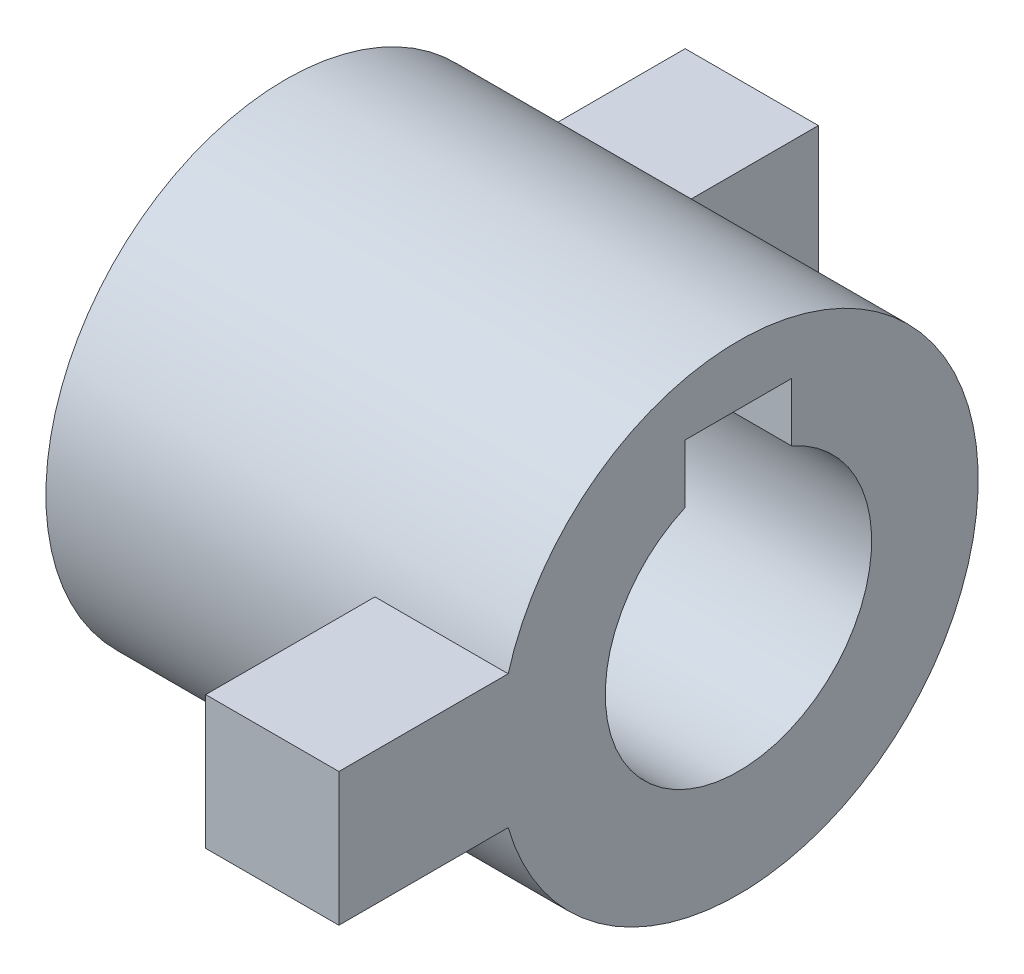
ISO-10303-21;
HEADER;
FILE_DESCRIPTION(('STEP AP214'),'2;1');
FILE_NAME('part.step','',(''),(''),'','','');
FILE_SCHEMA(('AUTOMOTIVE_DESIGN { 1 0 10303 214 1 1 1 1 }'));
ENDSEC;
DATA;
#1=APPLICATION_CONTEXT('core data for automotive mechanical design processes');
#2=APPLICATION_PROTOCOL_DEFINITION('international standard','automotive_design',2000,#1);
#3=PRODUCT_CONTEXT('',#1,'mechanical');
#4=PRODUCT('Part','Part','',(#3));
#5=PRODUCT_RELATED_PRODUCT_CATEGORY('part','',(#4));
#6=PRODUCT_DEFINITION_FORMATION('','',#4);
#7=PRODUCT_DEFINITION_CONTEXT('part definition',#1,'design');
#8=PRODUCT_DEFINITION('design','',#6,#7);
#9=PRODUCT_DEFINITION_SHAPE('','',#8);
#10=(LENGTH_UNIT() NAMED_UNIT(*) SI_UNIT(.MILLI.,.METRE.));
#11=(NAMED_UNIT(*) PLANE_ANGLE_UNIT() SI_UNIT($,.RADIAN.));
#12=(NAMED_UNIT(*) SI_UNIT($,.STERADIAN.) SOLID_ANGLE_UNIT());
#13=UNCERTAINTY_MEASURE_WITH_UNIT(LENGTH_MEASURE(1.E-05),#10,'distance_accuracy_value','');
#14=(GEOMETRIC_REPRESENTATION_CONTEXT(3) GLOBAL_UNCERTAINTY_ASSIGNED_CONTEXT((#13)) GLOBAL_UNIT_ASSIGNED_CONTEXT((#10,
#11,#12)) REPRESENTATION_CONTEXT('',''));
#15=CARTESIAN_POINT('',(0.,0.,0.));
#16=DIRECTION('',(0.,0.,1.));
#17=DIRECTION('',(1.,0.,0.));
#18=AXIS2_PLACEMENT_3D('',#15,#16,#17);
#19=CARTESIAN_POINT('',(17.,0.,0.));
#20=DIRECTION('',(-1.,0.,0.));
#21=DIRECTION('',(0.,0.,1.));
#22=AXIS2_PLACEMENT_3D('',#19,#20,#21);
#23=CYLINDRICAL_SURFACE('',#22,5.);
#24=CARTESIAN_POINT('',(17.,0.,0.));
#25=DIRECTION('',(1.,0.,0.));
#26=DIRECTION('',(0.,0.,-1.));
#27=AXIS2_PLACEMENT_3D('',#24,#25,#26);
#28=CIRCLE('',#27,5.);
#29=CARTESIAN_POINT('',(17.,4.58257569495584,2.));
#30=VERTEX_POINT('',#29);
#31=CARTESIAN_POINT('',(17.,4.58257569495584,-2.));
#32=VERTEX_POINT('',#31);
#33=EDGE_CURVE('E179',#30,#32,#28,.T.);
#34=ORIENTED_EDGE('',*,*,#33,.T.);
#35=DIRECTION('',(-1.,0.,0.));
#36=VECTOR('',#35,1.);
#37=CARTESIAN_POINT('',(17.,4.58257569495584,-2.));
#38=LINE('',#37,#36);
#39=CARTESIAN_POINT('',(0.,4.58257569495584,-2.));
#40=VERTEX_POINT('',#39);
#41=EDGE_CURVE('E190',#32,#40,#38,.T.);
#42=ORIENTED_EDGE('',*,*,#41,.T.);
#43=CARTESIAN_POINT('',(0.,0.,0.));
#44=DIRECTION('',(1.,0.,0.));
#45=DIRECTION('',(0.,0.,-1.));
#46=AXIS2_PLACEMENT_3D('',#43,#44,#45);
#47=CIRCLE('',#46,5.);
#48=CARTESIAN_POINT('',(0.,4.58257569495584,2.));
#49=VERTEX_POINT('',#48);
#50=EDGE_CURVE('E178',#49,#40,#47,.T.);
#51=ORIENTED_EDGE('',*,*,#50,.F.);
#52=DIRECTION('',(-1.,0.,0.));
#53=VECTOR('',#52,1.);
#54=CARTESIAN_POINT('',(17.,4.58257569495584,2.));
#55=LINE('',#54,#53);
#56=EDGE_CURVE('E209',#30,#49,#55,.T.);
#57=ORIENTED_EDGE('',*,*,#56,.F.);
#58=EDGE_LOOP('',(#34,#42,#51,#57));
#59=FACE_BOUND('',#58,.T.);
#60=ADVANCED_FACE('F35',(#59),#23,.F.);
#61=CARTESIAN_POINT('',(17.,0.,0.));
#62=DIRECTION('',(-1.,0.,0.));
#63=DIRECTION('',(0.,0.,1.));
#64=AXIS2_PLACEMENT_3D('',#61,#62,#63);
#65=CYLINDRICAL_SURFACE('',#64,9.);
#66=DIRECTION('',(-1.,0.,0.));
#67=VECTOR('',#66,1.);
#68=CARTESIAN_POINT('',(17.,-2.5,8.64580823289529));
#69=LINE('',#68,#67);
#70=CARTESIAN_POINT('',(17.,-2.5,8.64580823289529));
#71=VERTEX_POINT('',#70);
#72=CARTESIAN_POINT('',(12.,-2.5,8.64580823289529));
#73=VERTEX_POINT('',#72);
#74=EDGE_CURVE('E137',#71,#73,#69,.T.);
#75=ORIENTED_EDGE('',*,*,#74,.T.);
#76=CARTESIAN_POINT('',(12.,0.,0.));
#77=DIRECTION('',(1.,0.,0.));
#78=DIRECTION('',(0.,0.,-1.));
#79=AXIS2_PLACEMENT_3D('',#76,#77,#78);
#80=CIRCLE('',#79,9.);
#81=CARTESIAN_POINT('',(12.,2.5,8.64580823289529));
#82=VERTEX_POINT('',#81);
#83=EDGE_CURVE('E11',#82,#73,#80,.T.);
#84=ORIENTED_EDGE('',*,*,#83,.F.);
#85=DIRECTION('',(-1.,0.,0.));
#86=VECTOR('',#85,1.);
#87=CARTESIAN_POINT('',(17.,2.5,8.64580823289529));
#88=LINE('',#87,#86);
#89=CARTESIAN_POINT('',(17.,2.5,8.64580823289529));
#90=VERTEX_POINT('',#89);
#91=EDGE_CURVE('E164',#82,#90,#88,.F.);
#92=ORIENTED_EDGE('',*,*,#91,.T.);
#93=CARTESIAN_POINT('',(17.,0.,0.));
#94=DIRECTION('',(1.,0.,0.));
#95=DIRECTION('',(0.,0.,-1.));
#96=AXIS2_PLACEMENT_3D('',#93,#94,#95);
#97=CIRCLE('',#96,9.);
#98=EDGE_CURVE('E55',#71,#90,#97,.T.);
#99=ORIENTED_EDGE('',*,*,#98,.F.);
#100=EDGE_LOOP('',(#75,#84,#92,#99));
#101=FACE_BOUND('',#100,.T.);
#102=DIRECTION('',(-1.,0.,0.));
#103=VECTOR('',#102,1.);
#104=CARTESIAN_POINT('',(17.,-2.5,-8.64580823289529));
#105=LINE('',#104,#103);
#106=CARTESIAN_POINT('',(5.,-2.5,-8.64580823289529));
#107=VERTEX_POINT('',#106);
#108=CARTESIAN_POINT('',(0.,-2.5,-8.64580823289529));
#109=VERTEX_POINT('',#108);
#110=EDGE_CURVE('E156',#107,#109,#105,.T.);
#111=ORIENTED_EDGE('',*,*,#110,.F.);
#112=CARTESIAN_POINT('',(5.,0.,0.));
#113=DIRECTION('',(-1.,0.,0.));
#114=DIRECTION('',(0.,0.,1.));
#115=AXIS2_PLACEMENT_3D('',#112,#113,#114);
#116=CIRCLE('',#115,9.);
#117=CARTESIAN_POINT('',(5.,2.5,-8.64580823289529));
#118=VERTEX_POINT('',#117);
#119=EDGE_CURVE('E42',#118,#107,#116,.T.);
#120=ORIENTED_EDGE('',*,*,#119,.F.);
#121=DIRECTION('',(-1.,0.,0.));
#122=VECTOR('',#121,1.);
#123=CARTESIAN_POINT('',(17.,2.5,-8.64580823289529));
#124=LINE('',#123,#122);
#125=CARTESIAN_POINT('',(0.,2.5,-8.64580823289529));
#126=VERTEX_POINT('',#125);
#127=EDGE_CURVE('E176',#126,#118,#124,.F.);
#128=ORIENTED_EDGE('',*,*,#127,.F.);
#129=CARTESIAN_POINT('',(0.,0.,0.));
#130=DIRECTION('',(1.,0.,0.));
#131=DIRECTION('',(0.,0.,-1.));
#132=AXIS2_PLACEMENT_3D('',#129,#130,#131);
#133=CIRCLE('',#132,9.);
#134=EDGE_CURVE('E182',#126,#109,#133,.T.);
#135=ORIENTED_EDGE('',*,*,#134,.T.);
#136=EDGE_LOOP('',(#111,#120,#128,#135));
#137=FACE_BOUND('',#136,.T.);
#138=ADVANCED_FACE('F223',(#101,#137),#65,.T.);
#139=CARTESIAN_POINT('',(17.,0.,2.));
#140=DIRECTION('',(0.,0.,1.));
#141=DIRECTION('',(1.,0.,0.));
#142=AXIS2_PLACEMENT_3D('',#139,#140,#141);
#143=PLANE('',#142);
#144=DIRECTION('',(0.,1.,0.));
#145=VECTOR('',#144,1.);
#146=CARTESIAN_POINT('',(0.,0.,2.));
#147=LINE('',#146,#145);
#148=CARTESIAN_POINT('',(0.,6.78,2.));
#149=VERTEX_POINT('',#148);
#150=EDGE_CURVE('E192',#49,#149,#147,.T.);
#151=ORIENTED_EDGE('',*,*,#150,.T.);
#152=DIRECTION('',(-1.,0.,0.));
#153=VECTOR('',#152,1.);
#154=CARTESIAN_POINT('',(17.,6.78,2.));
#155=LINE('',#154,#153);
#156=CARTESIAN_POINT('',(17.,6.78,2.));
#157=VERTEX_POINT('',#156);
#158=EDGE_CURVE('E206',#157,#149,#155,.T.);
#159=ORIENTED_EDGE('',*,*,#158,.F.);
#160=DIRECTION('',(0.,1.,0.));
#161=VECTOR('',#160,1.);
#162=CARTESIAN_POINT('',(17.,0.,2.));
#163=LINE('',#162,#161);
#164=EDGE_CURVE('E181',#30,#157,#163,.T.);
#165=ORIENTED_EDGE('',*,*,#164,.F.);
#166=ORIENTED_EDGE('',*,*,#56,.T.);
#167=EDGE_LOOP('',(#151,#159,#165,#166));
#168=FACE_BOUND('',#167,.T.);
#169=ADVANCED_FACE('F248',(#168),#143,.F.);
#170=CARTESIAN_POINT('',(17.,6.78,0.));
#171=DIRECTION('',(0.,1.,0.));
#172=DIRECTION('',(0.,0.,1.));
#173=AXIS2_PLACEMENT_3D('',#170,#171,#172);
#174=PLANE('',#173);
#175=DIRECTION('',(0.,0.,-1.));
#176=VECTOR('',#175,1.);
#177=CARTESIAN_POINT('',(0.,6.78,0.));
#178=LINE('',#177,#176);
#179=CARTESIAN_POINT('',(0.,6.78,-2.));
#180=VERTEX_POINT('',#179);
#181=EDGE_CURVE('E194',#149,#180,#178,.T.);
#182=ORIENTED_EDGE('',*,*,#181,.T.);
#183=DIRECTION('',(-1.,0.,0.));
#184=VECTOR('',#183,1.);
#185=CARTESIAN_POINT('',(17.,6.78,-2.));
#186=LINE('',#185,#184);
#187=CARTESIAN_POINT('',(17.,6.78,-2.));
#188=VERTEX_POINT('',#187);
#189=EDGE_CURVE('E204',#188,#180,#186,.T.);
#190=ORIENTED_EDGE('',*,*,#189,.F.);
#191=DIRECTION('',(0.,0.,-1.));
#192=VECTOR('',#191,1.);
#193=CARTESIAN_POINT('',(17.,6.78,0.));
#194=LINE('',#193,#192);
#195=EDGE_CURVE('E184',#157,#188,#194,.T.);
#196=ORIENTED_EDGE('',*,*,#195,.F.);
#197=ORIENTED_EDGE('',*,*,#158,.T.);
#198=EDGE_LOOP('',(#182,#190,#196,#197));
#199=FACE_BOUND('',#198,.T.);
#200=ADVANCED_FACE('F263',(#199),#174,.F.);
#201=CARTESIAN_POINT('',(17.,0.,-2.));
#202=DIRECTION('',(0.,0.,1.));
#203=DIRECTION('',(1.,0.,0.));
#204=AXIS2_PLACEMENT_3D('',#201,#202,#203);
#205=PLANE('',#204);
#206=DIRECTION('',(0.,1.,0.));
#207=VECTOR('',#206,1.);
#208=CARTESIAN_POINT('',(0.,0.,-2.));
#209=LINE('',#208,#207);
#210=EDGE_CURVE('E197',#40,#180,#209,.T.);
#211=ORIENTED_EDGE('',*,*,#210,.F.);
#212=ORIENTED_EDGE('',*,*,#41,.F.);
#213=DIRECTION('',(0.,1.,0.));
#214=VECTOR('',#213,1.);
#215=CARTESIAN_POINT('',(17.,0.,-2.));
#216=LINE('',#215,#214);
#217=EDGE_CURVE('E186',#32,#188,#216,.T.);
#218=ORIENTED_EDGE('',*,*,#217,.T.);
#219=ORIENTED_EDGE('',*,*,#189,.T.);
#220=EDGE_LOOP('',(#211,#212,#218,#219));
#221=FACE_BOUND('',#220,.T.);
#222=ADVANCED_FACE('F258',(#221),#205,.T.);
#223=CARTESIAN_POINT('',(17.,0.,0.));
#224=DIRECTION('',(1.,0.,0.));
#225=DIRECTION('',(0.,0.,-1.));
#226=AXIS2_PLACEMENT_3D('',#223,#224,#225);
#227=PLANE('',#226);
#228=ORIENTED_EDGE('',*,*,#217,.F.);
#229=ORIENTED_EDGE('',*,*,#33,.F.);
#230=ORIENTED_EDGE('',*,*,#164,.T.);
#231=ORIENTED_EDGE('',*,*,#195,.T.);
#232=EDGE_LOOP('',(#228,#229,#230,#231));
#233=FACE_BOUND('',#232,.T.);
#234=DIRECTION('',(0.,0.,-1.));
#235=VECTOR('',#234,1.);
#236=CARTESIAN_POINT('',(17.,-2.5,0.));
#237=LINE('',#236,#235);
#238=CARTESIAN_POINT('',(17.,-2.5,15.));
#239=VERTEX_POINT('',#238);
#240=EDGE_CURVE('E124',#239,#71,#237,.T.);
#241=ORIENTED_EDGE('',*,*,#240,.T.);
#242=ORIENTED_EDGE('',*,*,#98,.T.);
#243=DIRECTION('',(0.,0.,-1.));
#244=VECTOR('',#243,1.);
#245=CARTESIAN_POINT('',(17.,2.5,0.));
#246=LINE('',#245,#244);
#247=CARTESIAN_POINT('',(17.,2.5,15.));
#248=VERTEX_POINT('',#247);
#249=EDGE_CURVE('E126',#248,#90,#246,.T.);
#250=ORIENTED_EDGE('',*,*,#249,.F.);
#251=DIRECTION('',(0.,-1.,0.));
#252=VECTOR('',#251,1.);
#253=CARTESIAN_POINT('',(17.,2.5,15.));
#254=LINE('',#253,#252);
#255=EDGE_CURVE('E121',#248,#239,#254,.T.);
#256=ORIENTED_EDGE('',*,*,#255,.T.);
#257=EDGE_LOOP('',(#241,#242,#250,#256));
#258=FACE_BOUND('',#257,.T.);
#259=ADVANCED_FACE('F123',(#233,#258),#227,.T.);
#260=CARTESIAN_POINT('',(0.,0.,0.));
#261=DIRECTION('',(1.,0.,0.));
#262=DIRECTION('',(0.,0.,-1.));
#263=AXIS2_PLACEMENT_3D('',#260,#261,#262);
#264=PLANE('',#263);
#265=ORIENTED_EDGE('',*,*,#50,.T.);
#266=ORIENTED_EDGE('',*,*,#210,.T.);
#267=ORIENTED_EDGE('',*,*,#181,.F.);
#268=ORIENTED_EDGE('',*,*,#150,.F.);
#269=EDGE_LOOP('',(#265,#266,#267,#268));
#270=FACE_BOUND('',#269,.T.);
#271=DIRECTION('',(0.,0.,1.));
#272=VECTOR('',#271,1.);
#273=CARTESIAN_POINT('',(0.,-2.5,0.));
#274=LINE('',#273,#272);
#275=CARTESIAN_POINT('',(0.,-2.5,-15.));
#276=VERTEX_POINT('',#275);
#277=EDGE_CURVE('E144',#276,#109,#274,.T.);
#278=ORIENTED_EDGE('',*,*,#277,.T.);
#279=ORIENTED_EDGE('',*,*,#134,.F.);
#280=DIRECTION('',(0.,0.,1.));
#281=VECTOR('',#280,1.);
#282=CARTESIAN_POINT('',(0.,2.5,0.));
#283=LINE('',#282,#281);
#284=CARTESIAN_POINT('',(0.,2.5,-15.));
#285=VERTEX_POINT('',#284);
#286=EDGE_CURVE('E166',#285,#126,#283,.T.);
#287=ORIENTED_EDGE('',*,*,#286,.F.);
#288=DIRECTION('',(0.,-1.,0.));
#289=VECTOR('',#288,1.);
#290=CARTESIAN_POINT('',(0.,2.5,-15.));
#291=LINE('',#290,#289);
#292=EDGE_CURVE('E172',#285,#276,#291,.T.);
#293=ORIENTED_EDGE('',*,*,#292,.T.);
#294=EDGE_LOOP('',(#278,#279,#287,#293));
#295=FACE_BOUND('',#294,.T.);
#296=ADVANCED_FACE('F227',(#270,#295),#264,.F.);
#297=CARTESIAN_POINT('',(0.,2.5,-15.));
#298=DIRECTION('',(0.,0.,1.));
#299=DIRECTION('',(1.,0.,0.));
#300=AXIS2_PLACEMENT_3D('',#297,#298,#299);
#301=PLANE('',#300);
#302=DIRECTION('',(0.,-1.,0.));
#303=VECTOR('',#302,1.);
#304=CARTESIAN_POINT('',(5.,2.5,-15.));
#305=LINE('',#304,#303);
#306=CARTESIAN_POINT('',(5.,2.5,-15.));
#307=VERTEX_POINT('',#306);
#308=CARTESIAN_POINT('',(5.,-2.5,-15.));
#309=VERTEX_POINT('',#308);
#310=EDGE_CURVE('E174',#307,#309,#305,.T.);
#311=ORIENTED_EDGE('',*,*,#310,.T.);
#312=DIRECTION('',(-1.,0.,0.));
#313=VECTOR('',#312,1.);
#314=CARTESIAN_POINT('',(0.,-2.5,-15.));
#315=LINE('',#314,#313);
#316=EDGE_CURVE('E150',#309,#276,#315,.T.);
#317=ORIENTED_EDGE('',*,*,#316,.T.);
#318=ORIENTED_EDGE('',*,*,#292,.F.);
#319=DIRECTION('',(-1.,0.,0.));
#320=VECTOR('',#319,1.);
#321=CARTESIAN_POINT('',(0.,2.5,-15.));
#322=LINE('',#321,#320);
#323=EDGE_CURVE('E170',#307,#285,#322,.T.);
#324=ORIENTED_EDGE('',*,*,#323,.F.);
#325=EDGE_LOOP('',(#311,#317,#318,#324));
#326=FACE_BOUND('',#325,.T.);
#327=ADVANCED_FACE('F230',(#326),#301,.F.);
#328=CARTESIAN_POINT('',(0.,2.5,0.));
#329=DIRECTION('',(0.,-1.,0.));
#330=DIRECTION('',(0.,0.,-1.));
#331=AXIS2_PLACEMENT_3D('',#328,#329,#330);
#332=PLANE('',#331);
#333=ORIENTED_EDGE('',*,*,#286,.T.);
#334=ORIENTED_EDGE('',*,*,#127,.T.);
#335=DIRECTION('',(0.,0.,-1.));
#336=VECTOR('',#335,1.);
#337=CARTESIAN_POINT('',(5.,2.5,0.));
#338=LINE('',#337,#336);
#339=EDGE_CURVE('E168',#118,#307,#338,.T.);
#340=ORIENTED_EDGE('',*,*,#339,.T.);
#341=ORIENTED_EDGE('',*,*,#323,.T.);
#342=EDGE_LOOP('',(#333,#334,#340,#341));
#343=FACE_BOUND('',#342,.T.);
#344=ADVANCED_FACE('F233',(#343),#332,.F.);
#345=CARTESIAN_POINT('',(5.,2.5,0.));
#346=DIRECTION('',(-1.,0.,0.));
#347=DIRECTION('',(0.,0.,1.));
#348=AXIS2_PLACEMENT_3D('',#345,#346,#347);
#349=PLANE('',#348);
#350=ORIENTED_EDGE('',*,*,#339,.F.);
#351=ORIENTED_EDGE('',*,*,#119,.T.);
#352=DIRECTION('',(0.,0.,-1.));
#353=VECTOR('',#352,1.);
#354=CARTESIAN_POINT('',(5.,-2.5,0.));
#355=LINE('',#354,#353);
#356=EDGE_CURVE('E153',#107,#309,#355,.T.);
#357=ORIENTED_EDGE('',*,*,#356,.T.);
#358=ORIENTED_EDGE('',*,*,#310,.F.);
#359=EDGE_LOOP('',(#350,#351,#357,#358));
#360=FACE_BOUND('',#359,.T.);
#361=ADVANCED_FACE('F214',(#360),#349,.F.);
#362=CARTESIAN_POINT('',(12.,2.5,15.));
#363=DIRECTION('',(0.,0.,-1.));
#364=DIRECTION('',(-1.,0.,0.));
#365=AXIS2_PLACEMENT_3D('',#362,#363,#364);
#366=PLANE('',#365);
#367=DIRECTION('',(0.,-1.,0.));
#368=VECTOR('',#367,1.);
#369=CARTESIAN_POINT('',(12.,2.5,15.));
#370=LINE('',#369,#368);
#371=CARTESIAN_POINT('',(12.,2.5,15.));
#372=VERTEX_POINT('',#371);
#373=CARTESIAN_POINT('',(12.,-2.5,15.));
#374=VERTEX_POINT('',#373);
#375=EDGE_CURVE('E130',#372,#374,#370,.T.);
#376=ORIENTED_EDGE('',*,*,#375,.T.);
#377=DIRECTION('',(1.,0.,0.));
#378=VECTOR('',#377,1.);
#379=CARTESIAN_POINT('',(12.,-2.5,15.));
#380=LINE('',#379,#378);
#381=EDGE_CURVE('E136',#374,#239,#380,.T.);
#382=ORIENTED_EDGE('',*,*,#381,.T.);
#383=ORIENTED_EDGE('',*,*,#255,.F.);
#384=DIRECTION('',(1.,0.,0.));
#385=VECTOR('',#384,1.);
#386=CARTESIAN_POINT('',(12.,2.5,15.));
#387=LINE('',#386,#385);
#388=EDGE_CURVE('E160',#372,#248,#387,.T.);
#389=ORIENTED_EDGE('',*,*,#388,.F.);
#390=EDGE_LOOP('',(#376,#382,#383,#389));
#391=FACE_BOUND('',#390,.T.);
#392=ADVANCED_FACE('F140',(#391),#366,.F.);
#393=CARTESIAN_POINT('',(0.,2.5,0.));
#394=DIRECTION('',(0.,1.,0.));
#395=DIRECTION('',(0.,0.,1.));
#396=AXIS2_PLACEMENT_3D('',#393,#394,#395);
#397=PLANE('',#396);
#398=ORIENTED_EDGE('',*,*,#91,.F.);
#399=DIRECTION('',(0.,0.,1.));
#400=VECTOR('',#399,1.);
#401=CARTESIAN_POINT('',(12.,2.5,0.));
#402=LINE('',#401,#400);
#403=EDGE_CURVE('E158',#82,#372,#402,.T.);
#404=ORIENTED_EDGE('',*,*,#403,.T.);
#405=ORIENTED_EDGE('',*,*,#388,.T.);
#406=ORIENTED_EDGE('',*,*,#249,.T.);
#407=EDGE_LOOP('',(#398,#404,#405,#406));
#408=FACE_BOUND('',#407,.T.);
#409=ADVANCED_FACE('F312',(#408),#397,.T.);
#410=CARTESIAN_POINT('',(12.,2.5,0.));
#411=DIRECTION('',(1.,0.,0.));
#412=DIRECTION('',(0.,0.,-1.));
#413=AXIS2_PLACEMENT_3D('',#410,#411,#412);
#414=PLANE('',#413);
#415=ORIENTED_EDGE('',*,*,#403,.F.);
#416=ORIENTED_EDGE('',*,*,#83,.T.);
#417=DIRECTION('',(0.,0.,1.));
#418=VECTOR('',#417,1.);
#419=CARTESIAN_POINT('',(12.,-2.5,0.));
#420=LINE('',#419,#418);
#421=EDGE_CURVE('E138',#73,#374,#420,.T.);
#422=ORIENTED_EDGE('',*,*,#421,.T.);
#423=ORIENTED_EDGE('',*,*,#375,.F.);
#424=EDGE_LOOP('',(#415,#416,#422,#423));
#425=FACE_BOUND('',#424,.T.);
#426=ADVANCED_FACE('F320',(#425),#414,.F.);
#427=CARTESIAN_POINT('',(0.,-2.5,0.));
#428=DIRECTION('',(0.,1.,0.));
#429=DIRECTION('',(0.,0.,-1.));
#430=AXIS2_PLACEMENT_3D('',#427,#428,#429);
#431=PLANE('',#430);
#432=ORIENTED_EDGE('',*,*,#356,.F.);
#433=ORIENTED_EDGE('',*,*,#110,.T.);
#434=ORIENTED_EDGE('',*,*,#277,.F.);
#435=ORIENTED_EDGE('',*,*,#316,.F.);
#436=EDGE_LOOP('',(#432,#433,#434,#435));
#437=FACE_BOUND('',#436,.T.);
#438=ADVANCED_FACE('F221',(#437),#431,.F.);
#439=CARTESIAN_POINT('',(0.,-2.5,0.));
#440=DIRECTION('',(0.,-1.,0.));
#441=DIRECTION('',(0.,0.,1.));
#442=AXIS2_PLACEMENT_3D('',#439,#440,#441);
#443=PLANE('',#442);
#444=ORIENTED_EDGE('',*,*,#74,.F.);
#445=ORIENTED_EDGE('',*,*,#240,.F.);
#446=ORIENTED_EDGE('',*,*,#381,.F.);
#447=ORIENTED_EDGE('',*,*,#421,.F.);
#448=EDGE_LOOP('',(#444,#445,#446,#447));
#449=FACE_BOUND('',#448,.T.);
#450=ADVANCED_FACE('F134',(#449),#443,.T.);
#451=CLOSED_SHELL('',(#60,#138,#169,#200,#222,#259,#296,#327,#344,#361,#392,#409,#426,#438,#450));
#452=MANIFOLD_SOLID_BREP('B2',#451);
#453=ADVANCED_BREP_SHAPE_REPRESENTATION('',(#18,#452),#14);
#454=SHAPE_DEFINITION_REPRESENTATION(#9,#453);
ENDSEC;
END-ISO-10303-21;
